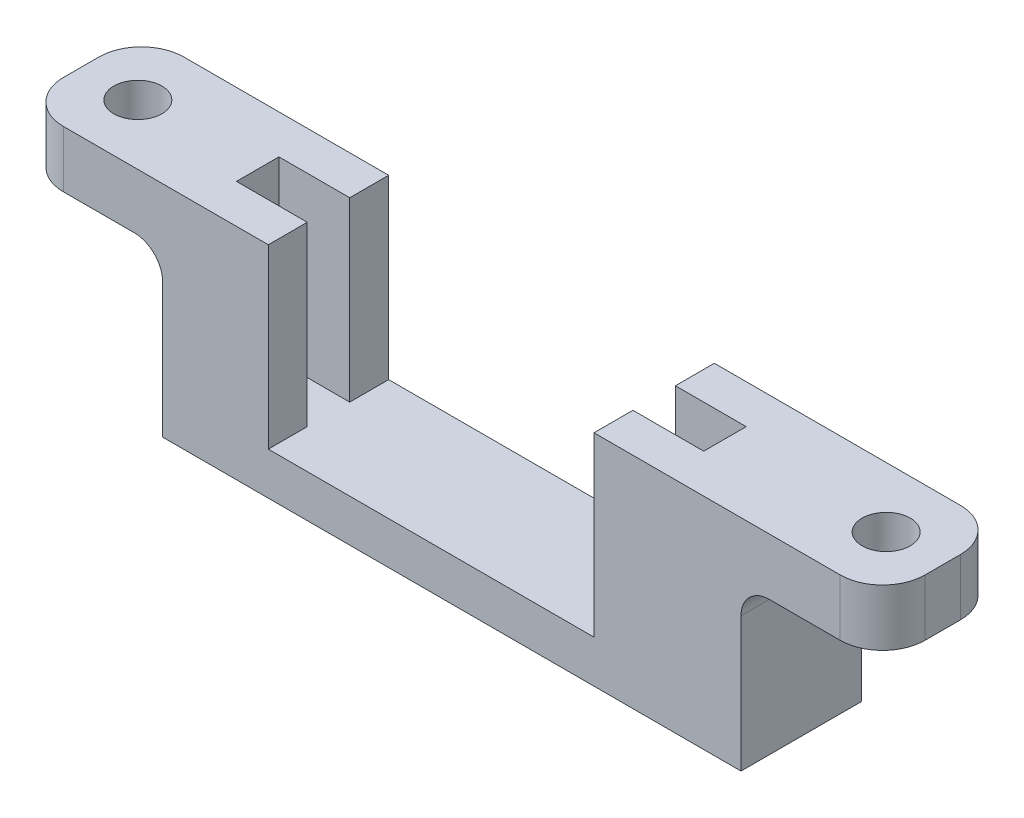
ISO-10303-21;
HEADER;
FILE_DESCRIPTION(('STEP AP214'),'2;1');
FILE_NAME('part.step','',(''),(''),'','','');
FILE_SCHEMA(('AUTOMOTIVE_DESIGN { 1 0 10303 214 1 1 1 1 }'));
ENDSEC;
DATA;
#1=APPLICATION_CONTEXT('core data for automotive mechanical design processes');
#2=APPLICATION_PROTOCOL_DEFINITION('international standard','automotive_design',2000,#1);
#3=PRODUCT_CONTEXT('',#1,'mechanical');
#4=PRODUCT('Part','Part','',(#3));
#5=PRODUCT_RELATED_PRODUCT_CATEGORY('part','',(#4));
#6=PRODUCT_DEFINITION_FORMATION('','',#4);
#7=PRODUCT_DEFINITION_CONTEXT('part definition',#1,'design');
#8=PRODUCT_DEFINITION('design','',#6,#7);
#9=PRODUCT_DEFINITION_SHAPE('','',#8);
#10=(LENGTH_UNIT() NAMED_UNIT(*) SI_UNIT(.MILLI.,.METRE.));
#11=(NAMED_UNIT(*) PLANE_ANGLE_UNIT() SI_UNIT($,.RADIAN.));
#12=(NAMED_UNIT(*) SI_UNIT($,.STERADIAN.) SOLID_ANGLE_UNIT());
#13=UNCERTAINTY_MEASURE_WITH_UNIT(LENGTH_MEASURE(1.E-05),#10,'distance_accuracy_value','');
#14=(GEOMETRIC_REPRESENTATION_CONTEXT(3) GLOBAL_UNCERTAINTY_ASSIGNED_CONTEXT((#13)) GLOBAL_UNIT_ASSIGNED_CONTEXT((#10,
#11,#12)) REPRESENTATION_CONTEXT('',''));
#15=CARTESIAN_POINT('',(0.,0.,0.));
#16=DIRECTION('',(0.,0.,1.));
#17=DIRECTION('',(1.,0.,0.));
#18=AXIS2_PLACEMENT_3D('',#15,#16,#17);
#19=CARTESIAN_POINT('',(-30.425,15.5,-4.25));
#20=DIRECTION('',(1.,0.,0.));
#21=DIRECTION('',(0.,0.,-1.));
#22=AXIS2_PLACEMENT_3D('',#19,#20,#21);
#23=PLANE('',#22);
#24=DIRECTION('',(0.,0.,1.));
#25=VECTOR('',#24,1.);
#26=CARTESIAN_POINT('',(-30.425,15.5,-4.25));
#27=LINE('',#26,#25);
#28=CARTESIAN_POINT('',(-30.425,15.5,-1.25));
#29=VERTEX_POINT('',#28);
#30=CARTESIAN_POINT('',(-30.425,15.5,1.25));
#31=VERTEX_POINT('',#30);
#32=EDGE_CURVE('E314',#29,#31,#27,.T.);
#33=ORIENTED_EDGE('',*,*,#32,.F.);
#34=DIRECTION('',(0.,-1.,0.));
#35=VECTOR('',#34,1.);
#36=CARTESIAN_POINT('',(-30.425,15.5,-1.25));
#37=LINE('',#36,#35);
#38=CARTESIAN_POINT('',(-30.425,11.5,-1.25));
#39=VERTEX_POINT('',#38);
#40=EDGE_CURVE('E303',#29,#39,#37,.T.);
#41=ORIENTED_EDGE('',*,*,#40,.T.);
#42=DIRECTION('',(0.,0.,-1.));
#43=VECTOR('',#42,1.);
#44=CARTESIAN_POINT('',(-30.425,11.5,4.25));
#45=LINE('',#44,#43);
#46=CARTESIAN_POINT('',(-30.425,11.5,1.25));
#47=VERTEX_POINT('',#46);
#48=EDGE_CURVE('E237',#47,#39,#45,.T.);
#49=ORIENTED_EDGE('',*,*,#48,.F.);
#50=DIRECTION('',(0.,-1.,0.));
#51=VECTOR('',#50,1.);
#52=CARTESIAN_POINT('',(-30.425,15.5,1.25));
#53=LINE('',#52,#51);
#54=EDGE_CURVE('E58',#47,#31,#53,.F.);
#55=ORIENTED_EDGE('',*,*,#54,.T.);
#56=EDGE_LOOP('',(#33,#41,#49,#55));
#57=FACE_BOUND('',#56,.T.);
#58=ADVANCED_FACE('F43',(#57),#23,.F.);
#59=CARTESIAN_POINT('',(-26.425,0.,0.));
#60=DIRECTION('',(0.,1.,0.));
#61=DIRECTION('',(0.,0.,1.));
#62=AXIS2_PLACEMENT_3D('',#59,#60,#61);
#63=CYLINDRICAL_SURFACE('',#62,1.7);
#64=CARTESIAN_POINT('',(-26.425,15.5,0.));
#65=DIRECTION('',(0.,1.,0.));
#66=DIRECTION('',(0.,0.,1.));
#67=AXIS2_PLACEMENT_3D('',#64,#65,#66);
#68=CIRCLE('',#67,1.7);
#69=CARTESIAN_POINT('',(-26.425,15.5,1.7));
#70=VERTEX_POINT('',#69);
#71=EDGE_CURVE('E249',#70,#70,#68,.T.);
#72=ORIENTED_EDGE('',*,*,#71,.T.);
#73=EDGE_LOOP('',(#72));
#74=FACE_BOUND('',#73,.T.);
#75=CARTESIAN_POINT('',(-26.425,11.5,0.));
#76=DIRECTION('',(0.,-1.,0.));
#77=DIRECTION('',(0.,0.,-1.));
#78=AXIS2_PLACEMENT_3D('',#75,#76,#77);
#79=CIRCLE('',#78,1.7);
#80=CARTESIAN_POINT('',(-26.425,11.5,-1.7));
#81=VERTEX_POINT('',#80);
#82=EDGE_CURVE('E227',#81,#81,#79,.F.);
#83=ORIENTED_EDGE('',*,*,#82,.F.);
#84=EDGE_LOOP('',(#83));
#85=FACE_BOUND('',#84,.T.);
#86=ADVANCED_FACE('F529',(#74,#85),#63,.F.);
#87=CARTESIAN_POINT('',(-30.425,15.5,-4.25));
#88=DIRECTION('',(0.,0.,1.));
#89=DIRECTION('',(1.,0.,0.));
#90=AXIS2_PLACEMENT_3D('',#87,#88,#89);
#91=PLANE('',#90);
#92=DIRECTION('',(-1.,0.,0.));
#93=VECTOR('',#92,1.);
#94=CARTESIAN_POINT('',(-30.425,15.5,-4.25));
#95=LINE('',#94,#93);
#96=CARTESIAN_POINT('',(27.425,15.5,-4.25));
#97=VERTEX_POINT('',#96);
#98=CARTESIAN_POINT('',(10.04,15.5,-4.25));
#99=VERTEX_POINT('',#98);
#100=EDGE_CURVE('E429',#97,#99,#95,.T.);
#101=ORIENTED_EDGE('',*,*,#100,.F.);
#102=DIRECTION('',(0.,-1.,0.));
#103=VECTOR('',#102,1.);
#104=CARTESIAN_POINT('',(27.425,15.5,-4.25));
#105=LINE('',#104,#103);
#106=CARTESIAN_POINT('',(27.425,11.5,-4.25));
#107=VERTEX_POINT('',#106);
#108=EDGE_CURVE('E281',#97,#107,#105,.T.);
#109=ORIENTED_EDGE('',*,*,#108,.T.);
#110=DIRECTION('',(1.,0.,0.));
#111=VECTOR('',#110,1.);
#112=CARTESIAN_POINT('',(30.425,11.5,-4.25));
#113=LINE('',#112,#111);
#114=CARTESIAN_POINT('',(22.425,11.5,-4.25));
#115=VERTEX_POINT('',#114);
#116=EDGE_CURVE('E336',#115,#107,#113,.T.);
#117=ORIENTED_EDGE('',*,*,#116,.F.);
#118=CARTESIAN_POINT('',(22.425,9.5,-4.25));
#119=DIRECTION('',(0.,0.,1.));
#120=DIRECTION('',(1.,0.,0.));
#121=AXIS2_PLACEMENT_3D('',#118,#119,#120);
#122=CIRCLE('',#121,2.);
#123=CARTESIAN_POINT('',(20.425,9.5,-4.25));
#124=VERTEX_POINT('',#123);
#125=EDGE_CURVE('E274',#115,#124,#122,.T.);
#126=ORIENTED_EDGE('',*,*,#125,.T.);
#127=DIRECTION('',(0.,-1.,0.));
#128=VECTOR('',#127,1.);
#129=CARTESIAN_POINT('',(20.425,11.5,-4.25));
#130=LINE('',#129,#128);
#131=CARTESIAN_POINT('',(20.425,0.,-4.25));
#132=VERTEX_POINT('',#131);
#133=EDGE_CURVE('E337',#124,#132,#130,.T.);
#134=ORIENTED_EDGE('',*,*,#133,.T.);
#135=DIRECTION('',(-1.,0.,0.));
#136=VECTOR('',#135,1.);
#137=CARTESIAN_POINT('',(-30.425,0.,-4.25));
#138=LINE('',#137,#136);
#139=CARTESIAN_POINT('',(-20.425,0.,-4.25));
#140=VERTEX_POINT('',#139);
#141=EDGE_CURVE('E244',#132,#140,#138,.T.);
#142=ORIENTED_EDGE('',*,*,#141,.T.);
#143=DIRECTION('',(0.,-1.,0.));
#144=VECTOR('',#143,1.);
#145=CARTESIAN_POINT('',(-20.425,11.5,-4.25));
#146=LINE('',#145,#144);
#147=CARTESIAN_POINT('',(-20.425,9.5,-4.25));
#148=VERTEX_POINT('',#147);
#149=EDGE_CURVE('E228',#148,#140,#146,.T.);
#150=ORIENTED_EDGE('',*,*,#149,.F.);
#151=CARTESIAN_POINT('',(-22.425,9.5,-4.25));
#152=DIRECTION('',(0.,0.,1.));
#153=DIRECTION('',(1.,0.,0.));
#154=AXIS2_PLACEMENT_3D('',#151,#152,#153);
#155=CIRCLE('',#154,2.);
#156=CARTESIAN_POINT('',(-22.425,11.5,-4.25));
#157=VERTEX_POINT('',#156);
#158=EDGE_CURVE('E271',#148,#157,#155,.T.);
#159=ORIENTED_EDGE('',*,*,#158,.T.);
#160=DIRECTION('',(1.,0.,0.));
#161=VECTOR('',#160,1.);
#162=CARTESIAN_POINT('',(-30.425,11.5,-4.25));
#163=LINE('',#162,#161);
#164=CARTESIAN_POINT('',(-27.425,11.5,-4.25));
#165=VERTEX_POINT('',#164);
#166=EDGE_CURVE('E328',#165,#157,#163,.T.);
#167=ORIENTED_EDGE('',*,*,#166,.F.);
#168=DIRECTION('',(0.,-1.,0.));
#169=VECTOR('',#168,1.);
#170=CARTESIAN_POINT('',(-27.425,15.5,-4.25));
#171=LINE('',#170,#169);
#172=CARTESIAN_POINT('',(-27.425,15.5,-4.25));
#173=VERTEX_POINT('',#172);
#174=EDGE_CURVE('E279',#165,#173,#171,.F.);
#175=ORIENTED_EDGE('',*,*,#174,.T.);
#176=CARTESIAN_POINT('',(-12.96,15.5,-4.25));
#177=VERTEX_POINT('',#176);
#178=EDGE_CURVE('E247',#177,#173,#95,.T.);
#179=ORIENTED_EDGE('',*,*,#178,.F.);
#180=DIRECTION('',(0.,1.,0.));
#181=VECTOR('',#180,1.);
#182=CARTESIAN_POINT('',(-12.96,3.,-4.25));
#183=LINE('',#182,#181);
#184=CARTESIAN_POINT('',(-12.96,3.,-4.25));
#185=VERTEX_POINT('',#184);
#186=EDGE_CURVE('E410',#185,#177,#183,.T.);
#187=ORIENTED_EDGE('',*,*,#186,.F.);
#188=DIRECTION('',(-1.,0.,0.));
#189=VECTOR('',#188,1.);
#190=CARTESIAN_POINT('',(0.,3.,-4.25));
#191=LINE('',#190,#189);
#192=CARTESIAN_POINT('',(10.04,3.,-4.25));
#193=VERTEX_POINT('',#192);
#194=EDGE_CURVE('E363',#193,#185,#191,.T.);
#195=ORIENTED_EDGE('',*,*,#194,.F.);
#196=DIRECTION('',(0.,1.,0.));
#197=VECTOR('',#196,1.);
#198=CARTESIAN_POINT('',(10.04,3.,-4.25));
#199=LINE('',#198,#197);
#200=EDGE_CURVE('E412',#193,#99,#199,.T.);
#201=ORIENTED_EDGE('',*,*,#200,.T.);
#202=EDGE_LOOP('',(#101,#109,#117,#126,#134,#142,#150,#159,#167,#175,#179,#187,#195,#201));
#203=FACE_BOUND('',#202,.T.);
#204=ADVANCED_FACE('F458',(#203),#91,.F.);
#205=CARTESIAN_POINT('',(-30.425,15.5,4.25));
#206=DIRECTION('',(0.,0.,-1.));
#207=DIRECTION('',(-1.,0.,0.));
#208=AXIS2_PLACEMENT_3D('',#205,#206,#207);
#209=PLANE('',#208);
#210=DIRECTION('',(-1.,0.,0.));
#211=VECTOR('',#210,1.);
#212=CARTESIAN_POINT('',(30.425,11.5,4.25));
#213=LINE('',#212,#211);
#214=CARTESIAN_POINT('',(27.425,11.5,4.25));
#215=VERTEX_POINT('',#214);
#216=CARTESIAN_POINT('',(22.425,11.5,4.25));
#217=VERTEX_POINT('',#216);
#218=EDGE_CURVE('E343',#215,#217,#213,.T.);
#219=ORIENTED_EDGE('',*,*,#218,.F.);
#220=DIRECTION('',(0.,-1.,0.));
#221=VECTOR('',#220,1.);
#222=CARTESIAN_POINT('',(27.425,15.5,4.25));
#223=LINE('',#222,#221);
#224=CARTESIAN_POINT('',(27.425,15.5,4.25));
#225=VERTEX_POINT('',#224);
#226=EDGE_CURVE('E300',#215,#225,#223,.F.);
#227=ORIENTED_EDGE('',*,*,#226,.T.);
#228=DIRECTION('',(1.,0.,0.));
#229=VECTOR('',#228,1.);
#230=CARTESIAN_POINT('',(-30.425,15.5,4.25));
#231=LINE('',#230,#229);
#232=CARTESIAN_POINT('',(10.04,15.5,4.25));
#233=VERTEX_POINT('',#232);
#234=EDGE_CURVE('E321',#233,#225,#231,.T.);
#235=ORIENTED_EDGE('',*,*,#234,.F.);
#236=DIRECTION('',(0.,1.,0.));
#237=VECTOR('',#236,1.);
#238=CARTESIAN_POINT('',(10.04,3.,4.25));
#239=LINE('',#238,#237);
#240=CARTESIAN_POINT('',(10.04,3.,4.25));
#241=VERTEX_POINT('',#240);
#242=EDGE_CURVE('E423',#241,#233,#239,.T.);
#243=ORIENTED_EDGE('',*,*,#242,.F.);
#244=DIRECTION('',(1.,0.,0.));
#245=VECTOR('',#244,1.);
#246=CARTESIAN_POINT('',(0.,3.,4.25));
#247=LINE('',#246,#245);
#248=CARTESIAN_POINT('',(-12.96,3.,4.25));
#249=VERTEX_POINT('',#248);
#250=EDGE_CURVE('E347',#249,#241,#247,.T.);
#251=ORIENTED_EDGE('',*,*,#250,.F.);
#252=DIRECTION('',(0.,1.,0.));
#253=VECTOR('',#252,1.);
#254=CARTESIAN_POINT('',(-12.96,3.,4.25));
#255=LINE('',#254,#253);
#256=CARTESIAN_POINT('',(-12.96,15.5,4.25));
#257=VERTEX_POINT('',#256);
#258=EDGE_CURVE('E320',#249,#257,#255,.T.);
#259=ORIENTED_EDGE('',*,*,#258,.T.);
#260=CARTESIAN_POINT('',(-27.425,15.5,4.25));
#261=VERTEX_POINT('',#260);
#262=EDGE_CURVE('E263',#261,#257,#231,.T.);
#263=ORIENTED_EDGE('',*,*,#262,.F.);
#264=DIRECTION('',(0.,-1.,0.));
#265=VECTOR('',#264,1.);
#266=CARTESIAN_POINT('',(-27.425,15.5,4.25));
#267=LINE('',#266,#265);
#268=CARTESIAN_POINT('',(-27.425,11.5,4.25));
#269=VERTEX_POINT('',#268);
#270=EDGE_CURVE('E297',#261,#269,#267,.T.);
#271=ORIENTED_EDGE('',*,*,#270,.T.);
#272=DIRECTION('',(-1.,0.,0.));
#273=VECTOR('',#272,1.);
#274=CARTESIAN_POINT('',(-30.425,11.5,4.25));
#275=LINE('',#274,#273);
#276=CARTESIAN_POINT('',(-22.425,11.5,4.25));
#277=VERTEX_POINT('',#276);
#278=EDGE_CURVE('E326',#277,#269,#275,.T.);
#279=ORIENTED_EDGE('',*,*,#278,.F.);
#280=CARTESIAN_POINT('',(-22.425,9.5,4.25));
#281=DIRECTION('',(0.,0.,-1.));
#282=DIRECTION('',(-1.,0.,0.));
#283=AXIS2_PLACEMENT_3D('',#280,#281,#282);
#284=CIRCLE('',#283,2.);
#285=CARTESIAN_POINT('',(-20.425,9.5,4.25));
#286=VERTEX_POINT('',#285);
#287=EDGE_CURVE('E224',#277,#286,#284,.T.);
#288=ORIENTED_EDGE('',*,*,#287,.T.);
#289=DIRECTION('',(0.,-1.,0.));
#290=VECTOR('',#289,1.);
#291=CARTESIAN_POINT('',(-20.425,11.5,4.25));
#292=LINE('',#291,#290);
#293=CARTESIAN_POINT('',(-20.425,0.,4.25));
#294=VERTEX_POINT('',#293);
#295=EDGE_CURVE('E216',#286,#294,#292,.T.);
#296=ORIENTED_EDGE('',*,*,#295,.T.);
#297=DIRECTION('',(1.,0.,0.));
#298=VECTOR('',#297,1.);
#299=CARTESIAN_POINT('',(-30.425,0.,4.25));
#300=LINE('',#299,#298);
#301=CARTESIAN_POINT('',(20.425,0.,4.25));
#302=VERTEX_POINT('',#301);
#303=EDGE_CURVE('E222',#294,#302,#300,.T.);
#304=ORIENTED_EDGE('',*,*,#303,.T.);
#305=DIRECTION('',(0.,-1.,0.));
#306=VECTOR('',#305,1.);
#307=CARTESIAN_POINT('',(20.425,11.5,4.25));
#308=LINE('',#307,#306);
#309=CARTESIAN_POINT('',(20.425,9.5,4.25));
#310=VERTEX_POINT('',#309);
#311=EDGE_CURVE('E334',#310,#302,#308,.T.);
#312=ORIENTED_EDGE('',*,*,#311,.F.);
#313=CARTESIAN_POINT('',(22.425,9.5,4.25));
#314=DIRECTION('',(0.,0.,-1.));
#315=DIRECTION('',(-1.,0.,0.));
#316=AXIS2_PLACEMENT_3D('',#313,#314,#315);
#317=CIRCLE('',#316,2.);
#318=EDGE_CURVE('E276',#310,#217,#317,.T.);
#319=ORIENTED_EDGE('',*,*,#318,.T.);
#320=EDGE_LOOP('',(#219,#227,#235,#243,#251,#259,#263,#271,#279,#288,#296,#304,#312,#319));
#321=FACE_BOUND('',#320,.T.);
#322=ADVANCED_FACE('F219',(#321),#209,.F.);
#323=CARTESIAN_POINT('',(0.,15.5,0.));
#324=DIRECTION('',(0.,1.,0.));
#325=DIRECTION('',(0.,0.,1.));
#326=AXIS2_PLACEMENT_3D('',#323,#324,#325);
#327=PLANE('',#326);
#328=ORIENTED_EDGE('',*,*,#71,.F.);
#329=EDGE_LOOP('',(#328));
#330=FACE_BOUND('',#329,.T.);
#331=ORIENTED_EDGE('',*,*,#178,.T.);
#332=CARTESIAN_POINT('',(-27.425,15.5,-1.25));
#333=DIRECTION('',(0.,1.,0.));
#334=DIRECTION('',(0.,0.,1.));
#335=AXIS2_PLACEMENT_3D('',#332,#333,#334);
#336=CIRCLE('',#335,3.);
#337=EDGE_CURVE('E11',#173,#29,#336,.T.);
#338=ORIENTED_EDGE('',*,*,#337,.T.);
#339=ORIENTED_EDGE('',*,*,#32,.T.);
#340=CARTESIAN_POINT('',(-27.425,15.5,1.25));
#341=DIRECTION('',(0.,1.,0.));
#342=DIRECTION('',(0.,0.,1.));
#343=AXIS2_PLACEMENT_3D('',#340,#341,#342);
#344=CIRCLE('',#343,3.);
#345=EDGE_CURVE('E51',#31,#261,#344,.T.);
#346=ORIENTED_EDGE('',*,*,#345,.T.);
#347=ORIENTED_EDGE('',*,*,#262,.T.);
#348=DIRECTION('',(0.,0.,-1.));
#349=VECTOR('',#348,1.);
#350=CARTESIAN_POINT('',(-12.96,15.5,0.));
#351=LINE('',#350,#349);
#352=CARTESIAN_POINT('',(-12.96,15.5,1.5));
#353=VERTEX_POINT('',#352);
#354=EDGE_CURVE('E351',#257,#353,#351,.T.);
#355=ORIENTED_EDGE('',*,*,#354,.T.);
#356=DIRECTION('',(1.,0.,0.));
#357=VECTOR('',#356,1.);
#358=CARTESIAN_POINT('',(0.,15.5,1.5));
#359=LINE('',#358,#357);
#360=CARTESIAN_POINT('',(-17.96,15.5,1.5));
#361=VERTEX_POINT('',#360);
#362=EDGE_CURVE('E397',#361,#353,#359,.T.);
#363=ORIENTED_EDGE('',*,*,#362,.F.);
#364=DIRECTION('',(0.,0.,-1.));
#365=VECTOR('',#364,1.);
#366=CARTESIAN_POINT('',(-17.96,15.5,0.));
#367=LINE('',#366,#365);
#368=CARTESIAN_POINT('',(-17.96,15.5,-1.5));
#369=VERTEX_POINT('',#368);
#370=EDGE_CURVE('E394',#361,#369,#367,.T.);
#371=ORIENTED_EDGE('',*,*,#370,.T.);
#372=DIRECTION('',(1.,0.,0.));
#373=VECTOR('',#372,1.);
#374=CARTESIAN_POINT('',(0.,15.5,-1.5));
#375=LINE('',#374,#373);
#376=CARTESIAN_POINT('',(-12.96,15.5,-1.5));
#377=VERTEX_POINT('',#376);
#378=EDGE_CURVE('E391',#369,#377,#375,.T.);
#379=ORIENTED_EDGE('',*,*,#378,.T.);
#380=EDGE_CURVE('E388',#377,#177,#351,.T.);
#381=ORIENTED_EDGE('',*,*,#380,.T.);
#382=EDGE_LOOP('',(#331,#338,#339,#346,#347,#355,#363,#371,#379,#381));
#383=FACE_BOUND('',#382,.T.);
#384=ADVANCED_FACE('F311',(#330,#383),#327,.T.);
#385=CARTESIAN_POINT('',(30.425,15.5,-4.25));
#386=DIRECTION('',(-1.,0.,0.));
#387=DIRECTION('',(0.,0.,1.));
#388=AXIS2_PLACEMENT_3D('',#385,#386,#387);
#389=PLANE('',#388);
#390=DIRECTION('',(0.,0.,1.));
#391=VECTOR('',#390,1.);
#392=CARTESIAN_POINT('',(30.425,11.5,4.25));
#393=LINE('',#392,#391);
#394=CARTESIAN_POINT('',(30.425,11.5,-1.25));
#395=VERTEX_POINT('',#394);
#396=CARTESIAN_POINT('',(30.425,11.5,1.25));
#397=VERTEX_POINT('',#396);
#398=EDGE_CURVE('E340',#395,#397,#393,.T.);
#399=ORIENTED_EDGE('',*,*,#398,.F.);
#400=DIRECTION('',(0.,-1.,0.));
#401=VECTOR('',#400,1.);
#402=CARTESIAN_POINT('',(30.425,15.5,-1.25));
#403=LINE('',#402,#401);
#404=CARTESIAN_POINT('',(30.425,15.5,-1.25));
#405=VERTEX_POINT('',#404);
#406=EDGE_CURVE('E291',#395,#405,#403,.F.);
#407=ORIENTED_EDGE('',*,*,#406,.T.);
#408=DIRECTION('',(0.,0.,-1.));
#409=VECTOR('',#408,1.);
#410=CARTESIAN_POINT('',(30.425,15.5,-4.25));
#411=LINE('',#410,#409);
#412=CARTESIAN_POINT('',(30.425,15.5,1.25));
#413=VERTEX_POINT('',#412);
#414=EDGE_CURVE('E243',#413,#405,#411,.T.);
#415=ORIENTED_EDGE('',*,*,#414,.F.);
#416=DIRECTION('',(0.,-1.,0.));
#417=VECTOR('',#416,1.);
#418=CARTESIAN_POINT('',(30.425,15.5,1.25));
#419=LINE('',#418,#417);
#420=EDGE_CURVE('E288',#413,#397,#419,.T.);
#421=ORIENTED_EDGE('',*,*,#420,.T.);
#422=EDGE_LOOP('',(#399,#407,#415,#421));
#423=FACE_BOUND('',#422,.T.);
#424=ADVANCED_FACE('F446',(#423),#389,.F.);
#425=ORIENTED_EDGE('',*,*,#414,.T.);
#426=CARTESIAN_POINT('',(27.425,15.5,-1.25));
#427=DIRECTION('',(0.,1.,0.));
#428=DIRECTION('',(0.,0.,1.));
#429=AXIS2_PLACEMENT_3D('',#426,#427,#428);
#430=CIRCLE('',#429,3.);
#431=EDGE_CURVE('E295',#405,#97,#430,.T.);
#432=ORIENTED_EDGE('',*,*,#431,.T.);
#433=ORIENTED_EDGE('',*,*,#100,.T.);
#434=DIRECTION('',(0.,0.,-1.));
#435=VECTOR('',#434,1.);
#436=CARTESIAN_POINT('',(10.04,15.5,0.));
#437=LINE('',#436,#435);
#438=CARTESIAN_POINT('',(10.04,15.5,-1.5));
#439=VERTEX_POINT('',#438);
#440=EDGE_CURVE('E379',#439,#99,#437,.T.);
#441=ORIENTED_EDGE('',*,*,#440,.F.);
#442=DIRECTION('',(-1.,0.,0.));
#443=VECTOR('',#442,1.);
#444=CARTESIAN_POINT('',(0.,15.5,-1.5));
#445=LINE('',#444,#443);
#446=CARTESIAN_POINT('',(15.04,15.5,-1.5));
#447=VERTEX_POINT('',#446);
#448=EDGE_CURVE('E385',#447,#439,#445,.T.);
#449=ORIENTED_EDGE('',*,*,#448,.F.);
#450=DIRECTION('',(0.,0.,-1.));
#451=VECTOR('',#450,1.);
#452=CARTESIAN_POINT('',(15.04,15.5,0.));
#453=LINE('',#452,#451);
#454=CARTESIAN_POINT('',(15.04,15.5,1.5));
#455=VERTEX_POINT('',#454);
#456=EDGE_CURVE('E382',#455,#447,#453,.T.);
#457=ORIENTED_EDGE('',*,*,#456,.F.);
#458=DIRECTION('',(-1.,0.,0.));
#459=VECTOR('',#458,1.);
#460=CARTESIAN_POINT('',(0.,15.5,1.5));
#461=LINE('',#460,#459);
#462=CARTESIAN_POINT('',(10.04,15.5,1.5));
#463=VERTEX_POINT('',#462);
#464=EDGE_CURVE('E378',#455,#463,#461,.T.);
#465=ORIENTED_EDGE('',*,*,#464,.T.);
#466=EDGE_CURVE('E258',#233,#463,#437,.T.);
#467=ORIENTED_EDGE('',*,*,#466,.F.);
#468=ORIENTED_EDGE('',*,*,#234,.T.);
#469=CARTESIAN_POINT('',(27.425,15.5,1.25));
#470=DIRECTION('',(0.,1.,0.));
#471=DIRECTION('',(0.,0.,1.));
#472=AXIS2_PLACEMENT_3D('',#469,#470,#471);
#473=CIRCLE('',#472,3.);
#474=EDGE_CURVE('E293',#225,#413,#473,.T.);
#475=ORIENTED_EDGE('',*,*,#474,.T.);
#476=EDGE_LOOP('',(#425,#432,#433,#441,#449,#457,#465,#467,#468,#475));
#477=FACE_BOUND('',#476,.T.);
#478=CARTESIAN_POINT('',(26.425,15.5,0.));
#479=DIRECTION('',(0.,1.,0.));
#480=DIRECTION('',(0.,0.,-1.));
#481=AXIS2_PLACEMENT_3D('',#478,#479,#480);
#482=CIRCLE('',#481,1.7);
#483=CARTESIAN_POINT('',(26.425,15.5,-1.7));
#484=VERTEX_POINT('',#483);
#485=EDGE_CURVE('E401',#484,#484,#482,.T.);
#486=ORIENTED_EDGE('',*,*,#485,.F.);
#487=EDGE_LOOP('',(#486));
#488=FACE_BOUND('',#487,.T.);
#489=ADVANCED_FACE('F436',(#477,#488),#327,.T.);
#490=CARTESIAN_POINT('',(0.,0.,0.));
#491=DIRECTION('',(0.,1.,0.));
#492=DIRECTION('',(0.,0.,1.));
#493=AXIS2_PLACEMENT_3D('',#490,#491,#492);
#494=PLANE('',#493);
#495=ORIENTED_EDGE('',*,*,#303,.F.);
#496=DIRECTION('',(0.,0.,1.));
#497=VECTOR('',#496,1.);
#498=CARTESIAN_POINT('',(-20.425,0.,4.25));
#499=LINE('',#498,#497);
#500=EDGE_CURVE('E231',#140,#294,#499,.T.);
#501=ORIENTED_EDGE('',*,*,#500,.F.);
#502=ORIENTED_EDGE('',*,*,#141,.F.);
#503=DIRECTION('',(0.,0.,-1.));
#504=VECTOR('',#503,1.);
#505=CARTESIAN_POINT('',(20.425,0.,4.25));
#506=LINE('',#505,#504);
#507=EDGE_CURVE('E238',#302,#132,#506,.T.);
#508=ORIENTED_EDGE('',*,*,#507,.F.);
#509=EDGE_LOOP('',(#495,#501,#502,#508));
#510=FACE_BOUND('',#509,.T.);
#511=ADVANCED_FACE('F241',(#510),#494,.F.);
#512=CARTESIAN_POINT('',(26.425,0.,0.));
#513=DIRECTION('',(0.,1.,0.));
#514=DIRECTION('',(0.,0.,1.));
#515=AXIS2_PLACEMENT_3D('',#512,#513,#514);
#516=CYLINDRICAL_SURFACE('',#515,1.7);
#517=CARTESIAN_POINT('',(26.425,11.5,0.));
#518=DIRECTION('',(0.,1.,0.));
#519=DIRECTION('',(0.,0.,1.));
#520=AXIS2_PLACEMENT_3D('',#517,#518,#519);
#521=CIRCLE('',#520,1.7);
#522=CARTESIAN_POINT('',(26.425,11.5,1.7));
#523=VERTEX_POINT('',#522);
#524=EDGE_CURVE('E255',#523,#523,#521,.F.);
#525=ORIENTED_EDGE('',*,*,#524,.T.);
#526=EDGE_LOOP('',(#525));
#527=FACE_BOUND('',#526,.T.);
#528=ORIENTED_EDGE('',*,*,#485,.T.);
#529=EDGE_LOOP('',(#528));
#530=FACE_BOUND('',#529,.T.);
#531=ADVANCED_FACE('F552',(#527,#530),#516,.F.);
#532=CARTESIAN_POINT('',(-12.96,3.,0.));
#533=DIRECTION('',(1.,0.,0.));
#534=DIRECTION('',(0.,0.,-1.));
#535=AXIS2_PLACEMENT_3D('',#532,#533,#534);
#536=PLANE('',#535);
#537=ORIENTED_EDGE('',*,*,#354,.F.);
#538=ORIENTED_EDGE('',*,*,#258,.F.);
#539=DIRECTION('',(0.,0.,-1.));
#540=VECTOR('',#539,1.);
#541=CARTESIAN_POINT('',(-12.96,3.,0.));
#542=LINE('',#541,#540);
#543=CARTESIAN_POINT('',(-12.96,3.,1.5));
#544=VERTEX_POINT('',#543);
#545=EDGE_CURVE('E369',#249,#544,#542,.T.);
#546=ORIENTED_EDGE('',*,*,#545,.T.);
#547=DIRECTION('',(0.,1.,0.));
#548=VECTOR('',#547,1.);
#549=CARTESIAN_POINT('',(-12.96,3.,1.5));
#550=LINE('',#549,#548);
#551=EDGE_CURVE('E402',#544,#353,#550,.T.);
#552=ORIENTED_EDGE('',*,*,#551,.T.);
#553=EDGE_LOOP('',(#537,#538,#546,#552));
#554=FACE_BOUND('',#553,.T.);
#555=ADVANCED_FACE('F488',(#554),#536,.T.);
#556=CARTESIAN_POINT('',(0.,3.,1.5));
#557=DIRECTION('',(0.,0.,1.));
#558=DIRECTION('',(1.,0.,0.));
#559=AXIS2_PLACEMENT_3D('',#556,#557,#558);
#560=PLANE('',#559);
#561=ORIENTED_EDGE('',*,*,#362,.T.);
#562=ORIENTED_EDGE('',*,*,#551,.F.);
#563=DIRECTION('',(1.,0.,0.));
#564=VECTOR('',#563,1.);
#565=CARTESIAN_POINT('',(0.,3.,1.5));
#566=LINE('',#565,#564);
#567=CARTESIAN_POINT('',(-17.96,3.,1.5));
#568=VERTEX_POINT('',#567);
#569=EDGE_CURVE('E373',#568,#544,#566,.T.);
#570=ORIENTED_EDGE('',*,*,#569,.F.);
#571=DIRECTION('',(0.,1.,0.));
#572=VECTOR('',#571,1.);
#573=CARTESIAN_POINT('',(-17.96,3.,1.5));
#574=LINE('',#573,#572);
#575=EDGE_CURVE('E404',#568,#361,#574,.T.);
#576=ORIENTED_EDGE('',*,*,#575,.T.);
#577=EDGE_LOOP('',(#561,#562,#570,#576));
#578=FACE_BOUND('',#577,.T.);
#579=ADVANCED_FACE('F490',(#578),#560,.F.);
#580=CARTESIAN_POINT('',(-17.96,3.,0.));
#581=DIRECTION('',(1.,0.,0.));
#582=DIRECTION('',(0.,0.,-1.));
#583=AXIS2_PLACEMENT_3D('',#580,#581,#582);
#584=PLANE('',#583);
#585=ORIENTED_EDGE('',*,*,#370,.F.);
#586=ORIENTED_EDGE('',*,*,#575,.F.);
#587=DIRECTION('',(0.,0.,-1.));
#588=VECTOR('',#587,1.);
#589=CARTESIAN_POINT('',(-17.96,3.,0.));
#590=LINE('',#589,#588);
#591=CARTESIAN_POINT('',(-17.96,3.,-1.5));
#592=VERTEX_POINT('',#591);
#593=EDGE_CURVE('E371',#568,#592,#590,.T.);
#594=ORIENTED_EDGE('',*,*,#593,.T.);
#595=DIRECTION('',(0.,1.,0.));
#596=VECTOR('',#595,1.);
#597=CARTESIAN_POINT('',(-17.96,3.,-1.5));
#598=LINE('',#597,#596);
#599=EDGE_CURVE('E406',#592,#369,#598,.T.);
#600=ORIENTED_EDGE('',*,*,#599,.T.);
#601=EDGE_LOOP('',(#585,#586,#594,#600));
#602=FACE_BOUND('',#601,.T.);
#603=ADVANCED_FACE('F495',(#602),#584,.T.);
#604=CARTESIAN_POINT('',(0.,3.,-1.5));
#605=DIRECTION('',(0.,0.,1.));
#606=DIRECTION('',(1.,0.,0.));
#607=AXIS2_PLACEMENT_3D('',#604,#605,#606);
#608=PLANE('',#607);
#609=ORIENTED_EDGE('',*,*,#378,.F.);
#610=ORIENTED_EDGE('',*,*,#599,.F.);
#611=DIRECTION('',(1.,0.,0.));
#612=VECTOR('',#611,1.);
#613=CARTESIAN_POINT('',(0.,3.,-1.5));
#614=LINE('',#613,#612);
#615=CARTESIAN_POINT('',(-12.96,3.,-1.5));
#616=VERTEX_POINT('',#615);
#617=EDGE_CURVE('E368',#592,#616,#614,.T.);
#618=ORIENTED_EDGE('',*,*,#617,.T.);
#619=DIRECTION('',(0.,1.,0.));
#620=VECTOR('',#619,1.);
#621=CARTESIAN_POINT('',(-12.96,3.,-1.5));
#622=LINE('',#621,#620);
#623=EDGE_CURVE('E408',#616,#377,#622,.T.);
#624=ORIENTED_EDGE('',*,*,#623,.T.);
#625=EDGE_LOOP('',(#609,#610,#618,#624));
#626=FACE_BOUND('',#625,.T.);
#627=ADVANCED_FACE('F499',(#626),#608,.T.);
#628=ORIENTED_EDGE('',*,*,#380,.F.);
#629=ORIENTED_EDGE('',*,*,#623,.F.);
#630=EDGE_CURVE('E366',#616,#185,#542,.T.);
#631=ORIENTED_EDGE('',*,*,#630,.T.);
#632=ORIENTED_EDGE('',*,*,#186,.T.);
#633=EDGE_LOOP('',(#628,#629,#631,#632));
#634=FACE_BOUND('',#633,.T.);
#635=ADVANCED_FACE('F504',(#634),#536,.T.);
#636=CARTESIAN_POINT('',(10.04,3.,0.));
#637=DIRECTION('',(1.,0.,0.));
#638=DIRECTION('',(0.,0.,-1.));
#639=AXIS2_PLACEMENT_3D('',#636,#637,#638);
#640=PLANE('',#639);
#641=ORIENTED_EDGE('',*,*,#440,.T.);
#642=ORIENTED_EDGE('',*,*,#200,.F.);
#643=DIRECTION('',(0.,0.,-1.));
#644=VECTOR('',#643,1.);
#645=CARTESIAN_POINT('',(10.04,3.,0.));
#646=LINE('',#645,#644);
#647=CARTESIAN_POINT('',(10.04,3.,-1.5));
#648=VERTEX_POINT('',#647);
#649=EDGE_CURVE('E355',#648,#193,#646,.T.);
#650=ORIENTED_EDGE('',*,*,#649,.F.);
#651=DIRECTION('',(0.,1.,0.));
#652=VECTOR('',#651,1.);
#653=CARTESIAN_POINT('',(10.04,3.,-1.5));
#654=LINE('',#653,#652);
#655=EDGE_CURVE('E415',#648,#439,#654,.T.);
#656=ORIENTED_EDGE('',*,*,#655,.T.);
#657=EDGE_LOOP('',(#641,#642,#650,#656));
#658=FACE_BOUND('',#657,.T.);
#659=ADVANCED_FACE('F464',(#658),#640,.F.);
#660=CARTESIAN_POINT('',(0.,3.,-1.5));
#661=DIRECTION('',(0.,0.,-1.));
#662=DIRECTION('',(-1.,0.,0.));
#663=AXIS2_PLACEMENT_3D('',#660,#661,#662);
#664=PLANE('',#663);
#665=ORIENTED_EDGE('',*,*,#448,.T.);
#666=ORIENTED_EDGE('',*,*,#655,.F.);
#667=DIRECTION('',(-1.,0.,0.));
#668=VECTOR('',#667,1.);
#669=CARTESIAN_POINT('',(0.,3.,-1.5));
#670=LINE('',#669,#668);
#671=CARTESIAN_POINT('',(15.04,3.,-1.5));
#672=VERTEX_POINT('',#671);
#673=EDGE_CURVE('E360',#672,#648,#670,.T.);
#674=ORIENTED_EDGE('',*,*,#673,.F.);
#675=DIRECTION('',(0.,1.,0.));
#676=VECTOR('',#675,1.);
#677=CARTESIAN_POINT('',(15.04,3.,-1.5));
#678=LINE('',#677,#676);
#679=EDGE_CURVE('E417',#672,#447,#678,.T.);
#680=ORIENTED_EDGE('',*,*,#679,.T.);
#681=EDGE_LOOP('',(#665,#666,#674,#680));
#682=FACE_BOUND('',#681,.T.);
#683=ADVANCED_FACE('F469',(#682),#664,.F.);
#684=CARTESIAN_POINT('',(15.04,3.,0.));
#685=DIRECTION('',(1.,0.,0.));
#686=DIRECTION('',(0.,0.,-1.));
#687=AXIS2_PLACEMENT_3D('',#684,#685,#686);
#688=PLANE('',#687);
#689=ORIENTED_EDGE('',*,*,#456,.T.);
#690=ORIENTED_EDGE('',*,*,#679,.F.);
#691=DIRECTION('',(0.,0.,-1.));
#692=VECTOR('',#691,1.);
#693=CARTESIAN_POINT('',(15.04,3.,0.));
#694=LINE('',#693,#692);
#695=CARTESIAN_POINT('',(15.04,3.,1.5));
#696=VERTEX_POINT('',#695);
#697=EDGE_CURVE('E357',#696,#672,#694,.T.);
#698=ORIENTED_EDGE('',*,*,#697,.F.);
#699=DIRECTION('',(0.,1.,0.));
#700=VECTOR('',#699,1.);
#701=CARTESIAN_POINT('',(15.04,3.,1.5));
#702=LINE('',#701,#700);
#703=EDGE_CURVE('E419',#696,#455,#702,.T.);
#704=ORIENTED_EDGE('',*,*,#703,.T.);
#705=EDGE_LOOP('',(#689,#690,#698,#704));
#706=FACE_BOUND('',#705,.T.);
#707=ADVANCED_FACE('F473',(#706),#688,.F.);
#708=CARTESIAN_POINT('',(0.,3.,1.5));
#709=DIRECTION('',(0.,0.,-1.));
#710=DIRECTION('',(-1.,0.,0.));
#711=AXIS2_PLACEMENT_3D('',#708,#709,#710);
#712=PLANE('',#711);
#713=ORIENTED_EDGE('',*,*,#464,.F.);
#714=ORIENTED_EDGE('',*,*,#703,.F.);
#715=DIRECTION('',(-1.,0.,0.));
#716=VECTOR('',#715,1.);
#717=CARTESIAN_POINT('',(0.,3.,1.5));
#718=LINE('',#717,#716);
#719=CARTESIAN_POINT('',(10.04,3.,1.5));
#720=VERTEX_POINT('',#719);
#721=EDGE_CURVE('E354',#696,#720,#718,.T.);
#722=ORIENTED_EDGE('',*,*,#721,.T.);
#723=DIRECTION('',(0.,1.,0.));
#724=VECTOR('',#723,1.);
#725=CARTESIAN_POINT('',(10.04,3.,1.5));
#726=LINE('',#725,#724);
#727=EDGE_CURVE('E421',#720,#463,#726,.T.);
#728=ORIENTED_EDGE('',*,*,#727,.T.);
#729=EDGE_LOOP('',(#713,#714,#722,#728));
#730=FACE_BOUND('',#729,.T.);
#731=ADVANCED_FACE('F477',(#730),#712,.T.);
#732=ORIENTED_EDGE('',*,*,#466,.T.);
#733=ORIENTED_EDGE('',*,*,#727,.F.);
#734=EDGE_CURVE('E350',#241,#720,#646,.T.);
#735=ORIENTED_EDGE('',*,*,#734,.F.);
#736=ORIENTED_EDGE('',*,*,#242,.T.);
#737=EDGE_LOOP('',(#732,#733,#735,#736));
#738=FACE_BOUND('',#737,.T.);
#739=ADVANCED_FACE('F480',(#738),#640,.F.);
#740=CARTESIAN_POINT('',(0.,3.,0.));
#741=DIRECTION('',(0.,1.,0.));
#742=DIRECTION('',(0.,0.,1.));
#743=AXIS2_PLACEMENT_3D('',#740,#741,#742);
#744=PLANE('',#743);
#745=ORIENTED_EDGE('',*,*,#250,.T.);
#746=ORIENTED_EDGE('',*,*,#734,.T.);
#747=ORIENTED_EDGE('',*,*,#721,.F.);
#748=ORIENTED_EDGE('',*,*,#697,.T.);
#749=ORIENTED_EDGE('',*,*,#673,.T.);
#750=ORIENTED_EDGE('',*,*,#649,.T.);
#751=ORIENTED_EDGE('',*,*,#194,.T.);
#752=ORIENTED_EDGE('',*,*,#630,.F.);
#753=ORIENTED_EDGE('',*,*,#617,.F.);
#754=ORIENTED_EDGE('',*,*,#593,.F.);
#755=ORIENTED_EDGE('',*,*,#569,.T.);
#756=ORIENTED_EDGE('',*,*,#545,.F.);
#757=EDGE_LOOP('',(#745,#746,#747,#748,#749,#750,#751,#752,#753,#754,#755,#756));
#758=FACE_BOUND('',#757,.T.);
#759=ADVANCED_FACE('F483',(#758),#744,.T.);
#760=CARTESIAN_POINT('',(0.,11.5,0.));
#761=DIRECTION('',(0.,-1.,0.));
#762=DIRECTION('',(0.,0.,-1.));
#763=AXIS2_PLACEMENT_3D('',#760,#761,#762);
#764=PLANE('',#763);
#765=ORIENTED_EDGE('',*,*,#48,.T.);
#766=CARTESIAN_POINT('',(-27.425,11.5,-1.25));
#767=DIRECTION('',(0.,-1.,0.));
#768=DIRECTION('',(0.,0.,-1.));
#769=AXIS2_PLACEMENT_3D('',#766,#767,#768);
#770=CIRCLE('',#769,3.);
#771=EDGE_CURVE('E308',#39,#165,#770,.T.);
#772=ORIENTED_EDGE('',*,*,#771,.T.);
#773=ORIENTED_EDGE('',*,*,#166,.T.);
#774=DIRECTION('',(0.,0.,1.));
#775=VECTOR('',#774,1.);
#776=CARTESIAN_POINT('',(-22.425,11.5,0.));
#777=LINE('',#776,#775);
#778=EDGE_CURVE('E259',#157,#277,#777,.T.);
#779=ORIENTED_EDGE('',*,*,#778,.T.);
#780=ORIENTED_EDGE('',*,*,#278,.T.);
#781=CARTESIAN_POINT('',(-27.425,11.5,1.25));
#782=DIRECTION('',(0.,-1.,0.));
#783=DIRECTION('',(0.,0.,-1.));
#784=AXIS2_PLACEMENT_3D('',#781,#782,#783);
#785=CIRCLE('',#784,3.);
#786=EDGE_CURVE('E306',#269,#47,#785,.T.);
#787=ORIENTED_EDGE('',*,*,#786,.T.);
#788=EDGE_LOOP('',(#765,#772,#773,#779,#780,#787));
#789=FACE_BOUND('',#788,.T.);
#790=ORIENTED_EDGE('',*,*,#82,.T.);
#791=EDGE_LOOP('',(#790));
#792=FACE_BOUND('',#791,.T.);
#793=ADVANCED_FACE('F324',(#789,#792),#764,.T.);
#794=CARTESIAN_POINT('',(-20.425,11.5,4.25));
#795=DIRECTION('',(1.,0.,0.));
#796=DIRECTION('',(0.,0.,-1.));
#797=AXIS2_PLACEMENT_3D('',#794,#795,#796);
#798=PLANE('',#797);
#799=ORIENTED_EDGE('',*,*,#295,.F.);
#800=DIRECTION('',(0.,0.,1.));
#801=VECTOR('',#800,1.);
#802=CARTESIAN_POINT('',(-20.425,9.5,4.25));
#803=LINE('',#802,#801);
#804=EDGE_CURVE('E262',#286,#148,#803,.F.);
#805=ORIENTED_EDGE('',*,*,#804,.T.);
#806=ORIENTED_EDGE('',*,*,#149,.T.);
#807=ORIENTED_EDGE('',*,*,#500,.T.);
#808=EDGE_LOOP('',(#799,#805,#806,#807));
#809=FACE_BOUND('',#808,.T.);
#810=ADVANCED_FACE('F232',(#809),#798,.F.);
#811=CARTESIAN_POINT('',(0.,11.5,0.));
#812=DIRECTION('',(0.,1.,0.));
#813=DIRECTION('',(0.,0.,1.));
#814=AXIS2_PLACEMENT_3D('',#811,#812,#813);
#815=PLANE('',#814);
#816=ORIENTED_EDGE('',*,*,#116,.T.);
#817=CARTESIAN_POINT('',(27.425,11.5,-1.25));
#818=DIRECTION('',(0.,1.,0.));
#819=DIRECTION('',(0.,0.,1.));
#820=AXIS2_PLACEMENT_3D('',#817,#818,#819);
#821=CIRCLE('',#820,3.);
#822=EDGE_CURVE('E286',#107,#395,#821,.F.);
#823=ORIENTED_EDGE('',*,*,#822,.T.);
#824=ORIENTED_EDGE('',*,*,#398,.T.);
#825=CARTESIAN_POINT('',(27.425,11.5,1.25));
#826=DIRECTION('',(0.,1.,0.));
#827=DIRECTION('',(0.,0.,1.));
#828=AXIS2_PLACEMENT_3D('',#825,#826,#827);
#829=CIRCLE('',#828,3.);
#830=EDGE_CURVE('E284',#397,#215,#829,.F.);
#831=ORIENTED_EDGE('',*,*,#830,.T.);
#832=ORIENTED_EDGE('',*,*,#218,.T.);
#833=DIRECTION('',(0.,0.,-1.));
#834=VECTOR('',#833,1.);
#835=CARTESIAN_POINT('',(22.425,11.5,-4.25));
#836=LINE('',#835,#834);
#837=EDGE_CURVE('E265',#217,#115,#836,.T.);
#838=ORIENTED_EDGE('',*,*,#837,.T.);
#839=EDGE_LOOP('',(#816,#823,#824,#831,#832,#838));
#840=FACE_BOUND('',#839,.T.);
#841=ORIENTED_EDGE('',*,*,#524,.F.);
#842=EDGE_LOOP('',(#841));
#843=FACE_BOUND('',#842,.T.);
#844=ADVANCED_FACE('F449',(#840,#843),#815,.F.);
#845=CARTESIAN_POINT('',(20.425,11.5,4.25));
#846=DIRECTION('',(-1.,0.,0.));
#847=DIRECTION('',(0.,0.,1.));
#848=AXIS2_PLACEMENT_3D('',#845,#846,#847);
#849=PLANE('',#848);
#850=ORIENTED_EDGE('',*,*,#133,.F.);
#851=DIRECTION('',(0.,0.,-1.));
#852=VECTOR('',#851,1.);
#853=CARTESIAN_POINT('',(20.425,9.5,4.25));
#854=LINE('',#853,#852);
#855=EDGE_CURVE('E268',#124,#310,#854,.F.);
#856=ORIENTED_EDGE('',*,*,#855,.T.);
#857=ORIENTED_EDGE('',*,*,#311,.T.);
#858=ORIENTED_EDGE('',*,*,#507,.T.);
#859=EDGE_LOOP('',(#850,#856,#857,#858));
#860=FACE_BOUND('',#859,.T.);
#861=ADVANCED_FACE('F517',(#860),#849,.F.);
#862=CARTESIAN_POINT('',(-22.425,9.5,0.));
#863=DIRECTION('',(0.,0.,1.));
#864=DIRECTION('',(1.,0.,0.));
#865=AXIS2_PLACEMENT_3D('',#862,#863,#864);
#866=CYLINDRICAL_SURFACE('',#865,2.);
#867=ORIENTED_EDGE('',*,*,#158,.F.);
#868=ORIENTED_EDGE('',*,*,#804,.F.);
#869=ORIENTED_EDGE('',*,*,#287,.F.);
#870=ORIENTED_EDGE('',*,*,#778,.F.);
#871=EDGE_LOOP('',(#867,#868,#869,#870));
#872=FACE_BOUND('',#871,.T.);
#873=ADVANCED_FACE('F514',(#872),#866,.F.);
#874=CARTESIAN_POINT('',(22.425,9.5,0.));
#875=DIRECTION('',(0.,0.,1.));
#876=DIRECTION('',(1.,0.,0.));
#877=AXIS2_PLACEMENT_3D('',#874,#875,#876);
#878=CYLINDRICAL_SURFACE('',#877,2.);
#879=ORIENTED_EDGE('',*,*,#318,.F.);
#880=ORIENTED_EDGE('',*,*,#855,.F.);
#881=ORIENTED_EDGE('',*,*,#125,.F.);
#882=ORIENTED_EDGE('',*,*,#837,.F.);
#883=EDGE_LOOP('',(#879,#880,#881,#882));
#884=FACE_BOUND('',#883,.T.);
#885=ADVANCED_FACE('F516',(#884),#878,.F.);
#886=CARTESIAN_POINT('',(27.425,15.5,-1.25));
#887=DIRECTION('',(0.,-1.,0.));
#888=DIRECTION('',(0.,0.,-1.));
#889=AXIS2_PLACEMENT_3D('',#886,#887,#888);
#890=CYLINDRICAL_SURFACE('',#889,3.);
#891=ORIENTED_EDGE('',*,*,#431,.F.);
#892=ORIENTED_EDGE('',*,*,#406,.F.);
#893=ORIENTED_EDGE('',*,*,#822,.F.);
#894=ORIENTED_EDGE('',*,*,#108,.F.);
#895=EDGE_LOOP('',(#891,#892,#893,#894));
#896=FACE_BOUND('',#895,.T.);
#897=ADVANCED_FACE('F455',(#896),#890,.T.);
#898=CARTESIAN_POINT('',(27.425,15.5,1.25));
#899=DIRECTION('',(0.,-1.,0.));
#900=DIRECTION('',(0.,0.,-1.));
#901=AXIS2_PLACEMENT_3D('',#898,#899,#900);
#902=CYLINDRICAL_SURFACE('',#901,3.);
#903=ORIENTED_EDGE('',*,*,#474,.F.);
#904=ORIENTED_EDGE('',*,*,#226,.F.);
#905=ORIENTED_EDGE('',*,*,#830,.F.);
#906=ORIENTED_EDGE('',*,*,#420,.F.);
#907=EDGE_LOOP('',(#903,#904,#905,#906));
#908=FACE_BOUND('',#907,.T.);
#909=ADVANCED_FACE('F443',(#908),#902,.T.);
#910=CARTESIAN_POINT('',(-27.425,15.5,-1.25));
#911=DIRECTION('',(0.,-1.,0.));
#912=DIRECTION('',(0.,0.,-1.));
#913=AXIS2_PLACEMENT_3D('',#910,#911,#912);
#914=CYLINDRICAL_SURFACE('',#913,3.);
#915=ORIENTED_EDGE('',*,*,#337,.F.);
#916=ORIENTED_EDGE('',*,*,#174,.F.);
#917=ORIENTED_EDGE('',*,*,#771,.F.);
#918=ORIENTED_EDGE('',*,*,#40,.F.);
#919=EDGE_LOOP('',(#915,#916,#917,#918));
#920=FACE_BOUND('',#919,.T.);
#921=ADVANCED_FACE('F510',(#920),#914,.T.);
#922=CARTESIAN_POINT('',(-27.425,15.5,1.25));
#923=DIRECTION('',(0.,-1.,0.));
#924=DIRECTION('',(0.,0.,-1.));
#925=AXIS2_PLACEMENT_3D('',#922,#923,#924);
#926=CYLINDRICAL_SURFACE('',#925,3.);
#927=ORIENTED_EDGE('',*,*,#345,.F.);
#928=ORIENTED_EDGE('',*,*,#54,.F.);
#929=ORIENTED_EDGE('',*,*,#786,.F.);
#930=ORIENTED_EDGE('',*,*,#270,.F.);
#931=EDGE_LOOP('',(#927,#928,#929,#930));
#932=FACE_BOUND('',#931,.T.);
#933=ADVANCED_FACE('F45',(#932),#926,.T.);
#934=CLOSED_SHELL('',(#58,#86,#204,#322,#384,#424,#489,#511,#531,#555,#579,#603,#627,#635,#659,
#683,#707,#731,#739,#759,#793,#810,#844,#861,#873,#885,#897,#909,#921,#933));
#935=MANIFOLD_SOLID_BREP('B2',#934);
#936=ADVANCED_BREP_SHAPE_REPRESENTATION('',(#18,#935),#14);
#937=SHAPE_DEFINITION_REPRESENTATION(#9,#936);
ENDSEC;
END-ISO-10303-21;
